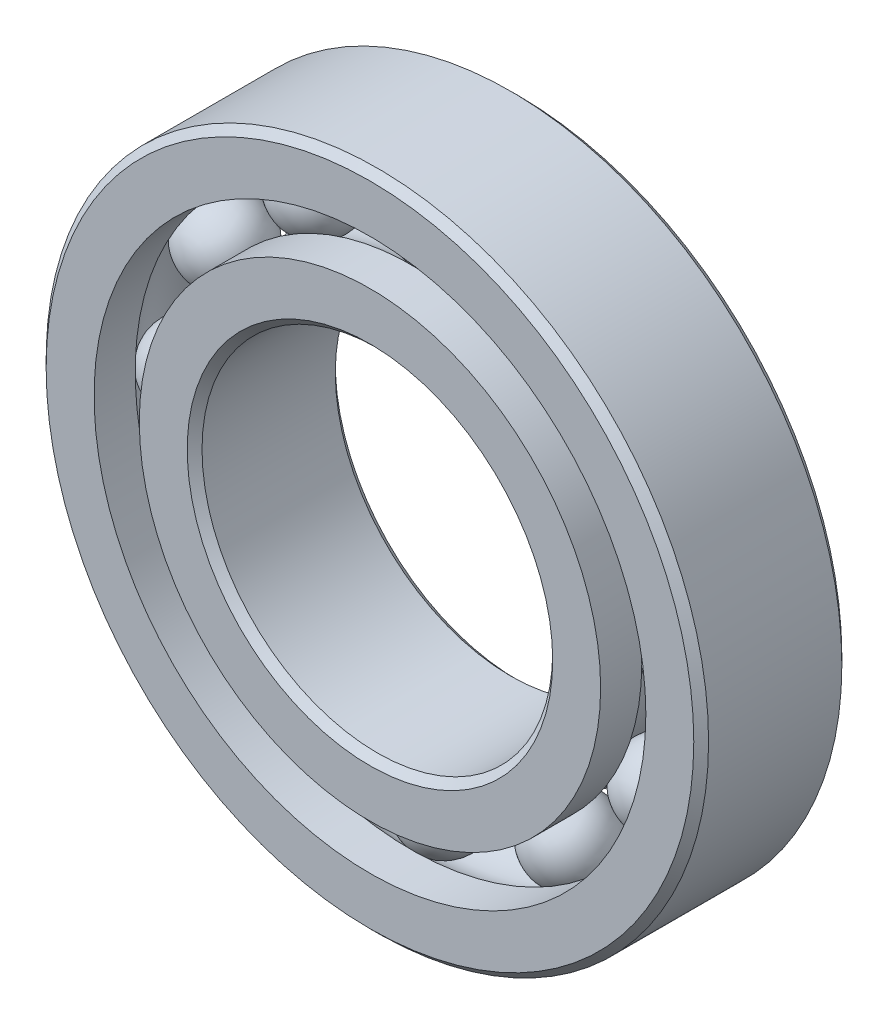
ISO-10303-21;
HEADER;
FILE_DESCRIPTION(('STEP AP214'),'2;1');
FILE_NAME('part.step','',(''),(''),'','','');
FILE_SCHEMA(('AUTOMOTIVE_DESIGN { 1 0 10303 214 1 1 1 1 }'));
ENDSEC;
DATA;
#1=APPLICATION_CONTEXT('core data for automotive mechanical design processes');
#2=APPLICATION_PROTOCOL_DEFINITION('international standard','automotive_design',2000,#1);
#3=PRODUCT_CONTEXT('',#1,'mechanical');
#4=PRODUCT('Part','Part','',(#3));
#5=PRODUCT_RELATED_PRODUCT_CATEGORY('part','',(#4));
#6=PRODUCT_DEFINITION_FORMATION('','',#4);
#7=PRODUCT_DEFINITION_CONTEXT('part definition',#1,'design');
#8=PRODUCT_DEFINITION('design','',#6,#7);
#9=PRODUCT_DEFINITION_SHAPE('','',#8);
#10=(LENGTH_UNIT() NAMED_UNIT(*) SI_UNIT(.MILLI.,.METRE.));
#11=(NAMED_UNIT(*) PLANE_ANGLE_UNIT() SI_UNIT($,.RADIAN.));
#12=(NAMED_UNIT(*) SI_UNIT($,.STERADIAN.) SOLID_ANGLE_UNIT());
#13=UNCERTAINTY_MEASURE_WITH_UNIT(LENGTH_MEASURE(1.E-05),#10,'distance_accuracy_value','');
#14=(GEOMETRIC_REPRESENTATION_CONTEXT(3) GLOBAL_UNCERTAINTY_ASSIGNED_CONTEXT((#13)) GLOBAL_UNIT_ASSIGNED_CONTEXT((#10,
#11,#12)) REPRESENTATION_CONTEXT('',''));
#15=CARTESIAN_POINT('',(0.,0.,0.));
#16=DIRECTION('',(0.,0.,1.));
#17=DIRECTION('',(1.,0.,0.));
#18=AXIS2_PLACEMENT_3D('',#15,#16,#17);
#19=CARTESIAN_POINT('',(-16.2498749999996,28.1456091166435,0.));
#20=DIRECTION('',(0.,0.,1.));
#21=DIRECTION('',(-0.499999999999989,0.866025403784445,0.));
#22=AXIS2_PLACEMENT_3D('',#19,#20,#21);
#23=SPHERICAL_SURFACE('',#22,5.12284445672367);
#24=CARTESIAN_POINT('',(-16.2498749999996,28.1456091166435,5.12284445672366));
#25=VERTEX_POINT('',#24);
#26=VERTEX_LOOP('',#25);
#27=FACE_BOUND('',#26,.T.);
#28=ADVANCED_FACE('F48',(#27),#23,.T.);
#29=CLOSED_SHELL('',(#28));
#30=MANIFOLD_SOLID_BREP('B2',#29);
#31=CARTESIAN_POINT('',(-28.1456091166431,16.2498750000003,0.));
#32=DIRECTION('',(0.,0.,1.));
#33=DIRECTION('',(-0.866025403784433,0.50000000000001,0.));
#34=AXIS2_PLACEMENT_3D('',#31,#32,#33);
#35=SPHERICAL_SURFACE('',#34,5.12284445672367);
#36=CARTESIAN_POINT('',(-28.1456091166431,16.2498750000003,5.12284445672366));
#37=VERTEX_POINT('',#36);
#38=VERTEX_LOOP('',#37);
#39=FACE_BOUND('',#38,.T.);
#40=ADVANCED_FACE('F71',(#39),#35,.T.);
#41=CLOSED_SHELL('',(#40));
#42=MANIFOLD_SOLID_BREP('B7',#41);
#43=CARTESIAN_POINT('',(-32.49975,3.40416811926201E-13,0.));
#44=DIRECTION('',(0.,0.,1.));
#45=DIRECTION('',(-1.,0.,0.));
#46=AXIS2_PLACEMENT_3D('',#43,#44,#45);
#47=SPHERICAL_SURFACE('',#46,5.12284445672367);
#48=CARTESIAN_POINT('',(-32.49975,3.40416811926201E-13,5.12284445672366));
#49=VERTEX_POINT('',#48);
#50=VERTEX_LOOP('',#49);
#51=FACE_BOUND('',#50,.T.);
#52=ADVANCED_FACE('F91',(#51),#47,.T.);
#53=CLOSED_SHELL('',(#52));
#54=MANIFOLD_SOLID_BREP('B44',#53);
#55=CARTESIAN_POINT('',(-28.1456091166435,-16.2498749999997,0.));
#56=DIRECTION('',(0.,0.,1.));
#57=DIRECTION('',(-0.866025403784443,-0.499999999999992,0.));
#58=AXIS2_PLACEMENT_3D('',#55,#56,#57);
#59=SPHERICAL_SURFACE('',#58,5.12284445672367);
#60=CARTESIAN_POINT('',(-28.1456091166435,-16.2498749999997,5.12284445672366));
#61=VERTEX_POINT('',#60);
#62=VERTEX_LOOP('',#61);
#63=FACE_BOUND('',#62,.T.);
#64=ADVANCED_FACE('F111',(#63),#59,.T.);
#65=CLOSED_SHELL('',(#64));
#66=MANIFOLD_SOLID_BREP('B67',#65);
#67=CARTESIAN_POINT('',(-16.2498750000002,-28.1456091166432,0.));
#68=DIRECTION('',(0.,0.,1.));
#69=DIRECTION('',(-0.500000000000007,-0.866025403784435,0.));
#70=AXIS2_PLACEMENT_3D('',#67,#68,#69);
#71=SPHERICAL_SURFACE('',#70,5.12284445672367);
#72=CARTESIAN_POINT('',(-16.2498750000002,-28.1456091166432,5.12284445672366));
#73=VERTEX_POINT('',#72);
#74=VERTEX_LOOP('',#73);
#75=FACE_BOUND('',#74,.T.);
#76=ADVANCED_FACE('F131',(#75),#71,.T.);
#77=CLOSED_SHELL('',(#76));
#78=MANIFOLD_SOLID_BREP('B87',#77);
#79=CARTESIAN_POINT('',(-2.26944541284134E-13,-32.49975,0.));
#80=DIRECTION('',(0.,0.,1.));
#81=DIRECTION('',(0.,-1.,0.));
#82=AXIS2_PLACEMENT_3D('',#79,#80,#81);
#83=SPHERICAL_SURFACE('',#82,5.12284445672367);
#84=CARTESIAN_POINT('',(-2.26944541284134E-13,-32.49975,5.12284445672366));
#85=VERTEX_POINT('',#84);
#86=VERTEX_LOOP('',#85);
#87=FACE_BOUND('',#86,.T.);
#88=ADVANCED_FACE('F151',(#87),#83,.T.);
#89=CLOSED_SHELL('',(#88));
#90=MANIFOLD_SOLID_BREP('B107',#89);
#91=CARTESIAN_POINT('',(16.2498749999998,-28.1456091166434,0.));
#92=DIRECTION('',(0.,0.,1.));
#93=DIRECTION('',(0.499999999999995,-0.866025403784442,0.));
#94=AXIS2_PLACEMENT_3D('',#91,#92,#93);
#95=SPHERICAL_SURFACE('',#94,5.12284445672367);
#96=CARTESIAN_POINT('',(16.2498749999998,-28.1456091166434,5.12284445672366));
#97=VERTEX_POINT('',#96);
#98=VERTEX_LOOP('',#97);
#99=FACE_BOUND('',#98,.T.);
#100=ADVANCED_FACE('F171',(#99),#95,.T.);
#101=CLOSED_SHELL('',(#100));
#102=MANIFOLD_SOLID_BREP('B127',#101);
#103=CARTESIAN_POINT('',(28.1456091166432,-16.2498750000001,0.));
#104=DIRECTION('',(0.,0.,1.));
#105=DIRECTION('',(0.866025403784436,-0.500000000000004,0.));
#106=AXIS2_PLACEMENT_3D('',#103,#104,#105);
#107=SPHERICAL_SURFACE('',#106,5.12284445672367);
#108=CARTESIAN_POINT('',(28.1456091166432,-16.2498750000001,5.12284445672366));
#109=VERTEX_POINT('',#108);
#110=VERTEX_LOOP('',#109);
#111=FACE_BOUND('',#110,.T.);
#112=ADVANCED_FACE('F191',(#111),#107,.T.);
#113=CLOSED_SHELL('',(#112));
#114=MANIFOLD_SOLID_BREP('B147',#113);
#115=CARTESIAN_POINT('',(32.49975,-1.13472270642067E-13,0.));
#116=DIRECTION('',(0.,0.,1.));
#117=DIRECTION('',(1.,0.,0.));
#118=AXIS2_PLACEMENT_3D('',#115,#116,#117);
#119=SPHERICAL_SURFACE('',#118,5.12284445672367);
#120=CARTESIAN_POINT('',(32.49975,-1.13472270642067E-13,5.12284445672366));
#121=VERTEX_POINT('',#120);
#122=VERTEX_LOOP('',#121);
#123=FACE_BOUND('',#122,.T.);
#124=ADVANCED_FACE('F211',(#123),#119,.T.);
#125=CLOSED_SHELL('',(#124));
#126=MANIFOLD_SOLID_BREP('B167',#125);
#127=CARTESIAN_POINT('',(28.1456091166433,16.2498749999999,0.));
#128=DIRECTION('',(0.,0.,1.));
#129=DIRECTION('',(0.86602540378444,0.499999999999998,0.));
#130=AXIS2_PLACEMENT_3D('',#127,#128,#129);
#131=SPHERICAL_SURFACE('',#130,5.12284445672367);
#132=CARTESIAN_POINT('',(28.1456091166433,16.2498749999999,5.12284445672366));
#133=VERTEX_POINT('',#132);
#134=VERTEX_LOOP('',#133);
#135=FACE_BOUND('',#134,.T.);
#136=ADVANCED_FACE('F231',(#135),#131,.T.);
#137=CLOSED_SHELL('',(#136));
#138=MANIFOLD_SOLID_BREP('B187',#137);
#139=CARTESIAN_POINT('',(16.249875,28.1456091166433,0.));
#140=DIRECTION('',(0.,0.,1.));
#141=DIRECTION('',(0.500000000000001,0.866025403784438,0.));
#142=AXIS2_PLACEMENT_3D('',#139,#140,#141);
#143=SPHERICAL_SURFACE('',#142,5.12284445672367);
#144=CARTESIAN_POINT('',(16.249875,28.1456091166433,5.12284445672366));
#145=VERTEX_POINT('',#144);
#146=VERTEX_LOOP('',#145);
#147=FACE_BOUND('',#146,.T.);
#148=ADVANCED_FACE('F252',(#147),#143,.T.);
#149=CLOSED_SHELL('',(#148));
#150=MANIFOLD_SOLID_BREP('B207',#149);
#151=CARTESIAN_POINT('',(0.,32.49975,0.));
#152=DIRECTION('',(0.,0.,1.));
#153=DIRECTION('',(0.,1.,0.));
#154=AXIS2_PLACEMENT_3D('',#151,#152,#153);
#155=SPHERICAL_SURFACE('',#154,5.12284445672367);
#156=CARTESIAN_POINT('',(0.,32.49975,5.12284445672366));
#157=VERTEX_POINT('',#156);
#158=VERTEX_LOOP('',#157);
#159=FACE_BOUND('',#158,.T.);
#160=ADVANCED_FACE('F278',(#159),#155,.T.);
#161=CLOSED_SHELL('',(#160));
#162=MANIFOLD_SOLID_BREP('B227',#161);
#163=CARTESIAN_POINT('',(0.,29.5986510989011,9.5));
#164=DIRECTION('',(0.,0.,-1.));
#165=DIRECTION('',(-1.,0.,0.));
#166=AXIS2_PLACEMENT_3D('',#163,#164,#165);
#167=PLANE('',#166);
#168=CARTESIAN_POINT('',(0.,0.,9.5));
#169=DIRECTION('',(0.,0.,1.));
#170=DIRECTION('',(1.,0.,0.));
#171=AXIS2_PLACEMENT_3D('',#168,#169,#170);
#172=CIRCLE('',#171,23.4495);
#173=CARTESIAN_POINT('',(23.4495,0.,9.5));
#174=VERTEX_POINT('',#173);
#175=EDGE_CURVE('E329',#174,#174,#172,.T.);
#176=ORIENTED_EDGE('',*,*,#175,.F.);
#177=EDGE_LOOP('',(#176));
#178=FACE_BOUND('',#177,.T.);
#179=CARTESIAN_POINT('',(0.,0.,9.5));
#180=DIRECTION('',(0.,0.,1.));
#181=DIRECTION('',(1.,0.,0.));
#182=AXIS2_PLACEMENT_3D('',#179,#180,#181);
#183=CIRCLE('',#182,29.5986510989011);
#184=CARTESIAN_POINT('',(29.5986510989011,0.,9.5));
#185=VERTEX_POINT('',#184);
#186=EDGE_CURVE('E277',#185,#185,#183,.T.);
#187=ORIENTED_EDGE('',*,*,#186,.T.);
#188=EDGE_LOOP('',(#187));
#189=FACE_BOUND('',#188,.T.);
#190=ADVANCED_FACE('F301',(#178,#189),#167,.F.);
#191=CARTESIAN_POINT('',(0.,0.,9.5));
#192=DIRECTION('',(0.,0.,1.));
#193=DIRECTION('',(1.,0.,0.));
#194=AXIS2_PLACEMENT_3D('',#191,#192,#193);
#195=CYLINDRICAL_SURFACE('',#194,29.5986510989011);
#196=ORIENTED_EDGE('',*,*,#186,.F.);
#197=EDGE_LOOP('',(#196));
#198=FACE_BOUND('',#197,.T.);
#199=CARTESIAN_POINT('',(0.,0.,4.22222222222222));
#200=DIRECTION('',(0.,0.,1.));
#201=DIRECTION('',(1.,0.,0.));
#202=AXIS2_PLACEMENT_3D('',#199,#200,#201);
#203=CIRCLE('',#202,29.5986510989011);
#204=CARTESIAN_POINT('',(29.5986510989011,0.,4.22222222222222));
#205=VERTEX_POINT('',#204);
#206=EDGE_CURVE('E307',#205,#205,#203,.T.);
#207=ORIENTED_EDGE('',*,*,#206,.T.);
#208=EDGE_LOOP('',(#207));
#209=FACE_BOUND('',#208,.T.);
#210=ADVANCED_FACE('F336',(#198,#209),#195,.T.);
#211=CARTESIAN_POINT('',(0.,0.,0.));
#212=DIRECTION('',(0.,0.,1.));
#213=DIRECTION('',(1.,0.,0.));
#214=AXIS2_PLACEMENT_3D('',#211,#212,#213);
#215=TOROIDAL_SURFACE('',#214,32.49975,5.12284445672366);
#216=ORIENTED_EDGE('',*,*,#206,.F.);
#217=EDGE_LOOP('',(#216));
#218=FACE_BOUND('',#217,.T.);
#219=CARTESIAN_POINT('',(0.,0.,-4.22222222222223));
#220=DIRECTION('',(0.,0.,1.));
#221=DIRECTION('',(1.,0.,0.));
#222=AXIS2_PLACEMENT_3D('',#219,#220,#221);
#223=CIRCLE('',#222,29.5986510989011);
#224=CARTESIAN_POINT('',(29.5986510989011,0.,-4.22222222222223));
#225=VERTEX_POINT('',#224);
#226=EDGE_CURVE('E311',#225,#225,#223,.T.);
#227=ORIENTED_EDGE('',*,*,#226,.T.);
#228=EDGE_LOOP('',(#227));
#229=FACE_BOUND('',#228,.T.);
#230=ADVANCED_FACE('F340',(#218,#229),#215,.F.);
#231=CARTESIAN_POINT('',(0.,0.,9.5));
#232=DIRECTION('',(0.,0.,1.));
#233=DIRECTION('',(1.,0.,0.));
#234=AXIS2_PLACEMENT_3D('',#231,#232,#233);
#235=CYLINDRICAL_SURFACE('',#234,29.5986510989011);
#236=ORIENTED_EDGE('',*,*,#226,.F.);
#237=EDGE_LOOP('',(#236));
#238=FACE_BOUND('',#237,.T.);
#239=CARTESIAN_POINT('',(0.,0.,-9.5));
#240=DIRECTION('',(0.,0.,1.));
#241=DIRECTION('',(1.,0.,0.));
#242=AXIS2_PLACEMENT_3D('',#239,#240,#241);
#243=CIRCLE('',#242,29.5986510989011);
#244=CARTESIAN_POINT('',(29.5986510989011,0.,-9.5));
#245=VERTEX_POINT('',#244);
#246=EDGE_CURVE('E315',#245,#245,#243,.T.);
#247=ORIENTED_EDGE('',*,*,#246,.T.);
#248=EDGE_LOOP('',(#247));
#249=FACE_BOUND('',#248,.T.);
#250=ADVANCED_FACE('F345',(#238,#249),#235,.T.);
#251=CARTESIAN_POINT('',(0.,23.4495,-9.5));
#252=DIRECTION('',(0.,0.,1.));
#253=DIRECTION('',(1.,0.,0.));
#254=AXIS2_PLACEMENT_3D('',#251,#252,#253);
#255=PLANE('',#254);
#256=ORIENTED_EDGE('',*,*,#246,.F.);
#257=EDGE_LOOP('',(#256));
#258=FACE_BOUND('',#257,.T.);
#259=CARTESIAN_POINT('',(0.,0.,-9.5));
#260=DIRECTION('',(0.,0.,1.));
#261=DIRECTION('',(1.,0.,0.));
#262=AXIS2_PLACEMENT_3D('',#259,#260,#261);
#263=CIRCLE('',#262,23.4495);
#264=CARTESIAN_POINT('',(23.4495,0.,-9.5));
#265=VERTEX_POINT('',#264);
#266=EDGE_CURVE('E320',#265,#265,#263,.T.);
#267=ORIENTED_EDGE('',*,*,#266,.T.);
#268=EDGE_LOOP('',(#267));
#269=FACE_BOUND('',#268,.T.);
#270=ADVANCED_FACE('F351',(#258,#269),#255,.F.);
#271=CARTESIAN_POINT('',(0.,0.,-8.55));
#272=DIRECTION('',(0.,0.,-1.));
#273=DIRECTION('',(-1.,0.,0.));
#274=AXIS2_PLACEMENT_3D('',#271,#272,#273);
#275=CONICAL_SURFACE('',#274,22.4995,0.785398163397448);
#276=ORIENTED_EDGE('',*,*,#266,.F.);
#277=EDGE_LOOP('',(#276));
#278=FACE_BOUND('',#277,.T.);
#279=CARTESIAN_POINT('',(0.,0.,-8.55));
#280=DIRECTION('',(0.,0.,1.));
#281=DIRECTION('',(1.,0.,0.));
#282=AXIS2_PLACEMENT_3D('',#279,#280,#281);
#283=CIRCLE('',#282,22.4995);
#284=CARTESIAN_POINT('',(22.4995,0.,-8.55));
#285=VERTEX_POINT('',#284);
#286=EDGE_CURVE('E323',#285,#285,#283,.T.);
#287=ORIENTED_EDGE('',*,*,#286,.T.);
#288=EDGE_LOOP('',(#287));
#289=FACE_BOUND('',#288,.T.);
#290=ADVANCED_FACE('F355',(#278,#289),#275,.F.);
#291=CARTESIAN_POINT('',(0.,0.,9.5));
#292=DIRECTION('',(0.,0.,1.));
#293=DIRECTION('',(1.,0.,0.));
#294=AXIS2_PLACEMENT_3D('',#291,#292,#293);
#295=CYLINDRICAL_SURFACE('',#294,22.4995);
#296=ORIENTED_EDGE('',*,*,#286,.F.);
#297=EDGE_LOOP('',(#296));
#298=FACE_BOUND('',#297,.T.);
#299=CARTESIAN_POINT('',(0.,0.,8.55));
#300=DIRECTION('',(0.,0.,1.));
#301=DIRECTION('',(1.,0.,0.));
#302=AXIS2_PLACEMENT_3D('',#299,#300,#301);
#303=CIRCLE('',#302,22.4995);
#304=CARTESIAN_POINT('',(22.4995,0.,8.55));
#305=VERTEX_POINT('',#304);
#306=EDGE_CURVE('E326',#305,#305,#303,.T.);
#307=ORIENTED_EDGE('',*,*,#306,.T.);
#308=EDGE_LOOP('',(#307));
#309=FACE_BOUND('',#308,.T.);
#310=ADVANCED_FACE('F359',(#298,#309),#295,.F.);
#311=CARTESIAN_POINT('',(0.,0.,9.5));
#312=DIRECTION('',(0.,0.,1.));
#313=DIRECTION('',(1.,0.,0.));
#314=AXIS2_PLACEMENT_3D('',#311,#312,#313);
#315=CONICAL_SURFACE('',#314,23.4495,0.785398163397451);
#316=ORIENTED_EDGE('',*,*,#306,.F.);
#317=EDGE_LOOP('',(#316));
#318=FACE_BOUND('',#317,.T.);
#319=ORIENTED_EDGE('',*,*,#175,.T.);
#320=EDGE_LOOP('',(#319));
#321=FACE_BOUND('',#320,.T.);
#322=ADVANCED_FACE('F333',(#318,#321),#315,.F.);
#323=CLOSED_SHELL('',(#190,#210,#230,#250,#270,#290,#310,#322));
#324=MANIFOLD_SOLID_BREP('B248',#323);
#325=CARTESIAN_POINT('',(0.,0.,8.55000000000001));
#326=DIRECTION('',(0.,0.,-1.));
#327=DIRECTION('',(-1.,0.,0.));
#328=AXIS2_PLACEMENT_3D('',#325,#326,#327);
#329=CONICAL_SURFACE('',#328,42.5,0.785398163397448);
#330=CARTESIAN_POINT('',(0.,0.,9.50000000000001));
#331=DIRECTION('',(0.,0.,1.));
#332=DIRECTION('',(1.,0.,0.));
#333=AXIS2_PLACEMENT_3D('',#330,#331,#332);
#334=CIRCLE('',#333,41.55);
#335=CARTESIAN_POINT('',(41.55,0.,9.50000000000001));
#336=VERTEX_POINT('',#335);
#337=EDGE_CURVE('E453',#336,#336,#334,.T.);
#338=ORIENTED_EDGE('',*,*,#337,.F.);
#339=EDGE_LOOP('',(#338));
#340=FACE_BOUND('',#339,.T.);
#341=CARTESIAN_POINT('',(0.,0.,8.55000000000001));
#342=DIRECTION('',(0.,0.,1.));
#343=DIRECTION('',(1.,0.,0.));
#344=AXIS2_PLACEMENT_3D('',#341,#342,#343);
#345=CIRCLE('',#344,42.5);
#346=CARTESIAN_POINT('',(42.5,0.,8.55000000000001));
#347=VERTEX_POINT('',#346);
#348=EDGE_CURVE('E300',#347,#347,#345,.T.);
#349=ORIENTED_EDGE('',*,*,#348,.T.);
#350=EDGE_LOOP('',(#349));
#351=FACE_BOUND('',#350,.T.);
#352=ADVANCED_FACE('F425',(#340,#351),#329,.T.);
#353=CARTESIAN_POINT('',(0.,0.,9.5));
#354=DIRECTION('',(0.,0.,1.));
#355=DIRECTION('',(1.,0.,0.));
#356=AXIS2_PLACEMENT_3D('',#353,#354,#355);
#357=CYLINDRICAL_SURFACE('',#356,42.5);
#358=ORIENTED_EDGE('',*,*,#348,.F.);
#359=EDGE_LOOP('',(#358));
#360=FACE_BOUND('',#359,.T.);
#361=CARTESIAN_POINT('',(0.,0.,-8.55));
#362=DIRECTION('',(0.,0.,1.));
#363=DIRECTION('',(1.,0.,0.));
#364=AXIS2_PLACEMENT_3D('',#361,#362,#363);
#365=CIRCLE('',#364,42.5);
#366=CARTESIAN_POINT('',(42.5,0.,-8.55));
#367=VERTEX_POINT('',#366);
#368=EDGE_CURVE('E431',#367,#367,#365,.T.);
#369=ORIENTED_EDGE('',*,*,#368,.T.);
#370=EDGE_LOOP('',(#369));
#371=FACE_BOUND('',#370,.T.);
#372=ADVANCED_FACE('F460',(#360,#371),#357,.T.);
#373=CARTESIAN_POINT('',(0.,0.,-9.5));
#374=DIRECTION('',(0.,0.,1.));
#375=DIRECTION('',(1.,0.,0.));
#376=AXIS2_PLACEMENT_3D('',#373,#374,#375);
#377=CONICAL_SURFACE('',#376,41.55,0.785398163397448);
#378=ORIENTED_EDGE('',*,*,#368,.F.);
#379=EDGE_LOOP('',(#378));
#380=FACE_BOUND('',#379,.T.);
#381=CARTESIAN_POINT('',(0.,0.,-9.5));
#382=DIRECTION('',(0.,0.,1.));
#383=DIRECTION('',(1.,0.,0.));
#384=AXIS2_PLACEMENT_3D('',#381,#382,#383);
#385=CIRCLE('',#384,41.55);
#386=CARTESIAN_POINT('',(41.55,0.,-9.5));
#387=VERTEX_POINT('',#386);
#388=EDGE_CURVE('E435',#387,#387,#385,.T.);
#389=ORIENTED_EDGE('',*,*,#388,.T.);
#390=EDGE_LOOP('',(#389));
#391=FACE_BOUND('',#390,.T.);
#392=ADVANCED_FACE('F464',(#380,#391),#377,.T.);
#393=CARTESIAN_POINT('',(0.,41.55,-9.50000000000001));
#394=DIRECTION('',(0.,0.,1.));
#395=DIRECTION('',(1.,0.,0.));
#396=AXIS2_PLACEMENT_3D('',#393,#394,#395);
#397=PLANE('',#396);
#398=ORIENTED_EDGE('',*,*,#388,.F.);
#399=EDGE_LOOP('',(#398));
#400=FACE_BOUND('',#399,.T.);
#401=CARTESIAN_POINT('',(0.,0.,-9.50000000000001));
#402=DIRECTION('',(0.,0.,1.));
#403=DIRECTION('',(1.,0.,0.));
#404=AXIS2_PLACEMENT_3D('',#401,#402,#403);
#405=CIRCLE('',#404,35.4008489010989);
#406=CARTESIAN_POINT('',(35.4008489010989,0.,-9.50000000000001));
#407=VERTEX_POINT('',#406);
#408=EDGE_CURVE('E439',#407,#407,#405,.T.);
#409=ORIENTED_EDGE('',*,*,#408,.T.);
#410=EDGE_LOOP('',(#409));
#411=FACE_BOUND('',#410,.T.);
#412=ADVANCED_FACE('F469',(#400,#411),#397,.F.);
#413=CARTESIAN_POINT('',(0.,0.,9.5));
#414=DIRECTION('',(0.,0.,1.));
#415=DIRECTION('',(1.,0.,0.));
#416=AXIS2_PLACEMENT_3D('',#413,#414,#415);
#417=CYLINDRICAL_SURFACE('',#416,35.4008489010989);
#418=ORIENTED_EDGE('',*,*,#408,.F.);
#419=EDGE_LOOP('',(#418));
#420=FACE_BOUND('',#419,.T.);
#421=CARTESIAN_POINT('',(0.,0.,-4.22222222222222));
#422=DIRECTION('',(0.,0.,1.));
#423=DIRECTION('',(1.,0.,0.));
#424=AXIS2_PLACEMENT_3D('',#421,#422,#423);
#425=CIRCLE('',#424,35.4008489010989);
#426=CARTESIAN_POINT('',(35.4008489010989,0.,-4.22222222222222));
#427=VERTEX_POINT('',#426);
#428=EDGE_CURVE('E444',#427,#427,#425,.T.);
#429=ORIENTED_EDGE('',*,*,#428,.T.);
#430=EDGE_LOOP('',(#429));
#431=FACE_BOUND('',#430,.T.);
#432=ADVANCED_FACE('F475',(#420,#431),#417,.F.);
#433=CARTESIAN_POINT('',(0.,0.,0.));
#434=DIRECTION('',(0.,0.,1.));
#435=DIRECTION('',(1.,0.,0.));
#436=AXIS2_PLACEMENT_3D('',#433,#434,#435);
#437=TOROIDAL_SURFACE('',#436,32.49975,5.12284445672366);
#438=ORIENTED_EDGE('',*,*,#428,.F.);
#439=EDGE_LOOP('',(#438));
#440=FACE_BOUND('',#439,.T.);
#441=CARTESIAN_POINT('',(0.,0.,4.22222222222222));
#442=DIRECTION('',(0.,0.,1.));
#443=DIRECTION('',(1.,0.,0.));
#444=AXIS2_PLACEMENT_3D('',#441,#442,#443);
#445=CIRCLE('',#444,35.4008489010989);
#446=CARTESIAN_POINT('',(35.4008489010989,0.,4.22222222222222));
#447=VERTEX_POINT('',#446);
#448=EDGE_CURVE('E447',#447,#447,#445,.T.);
#449=ORIENTED_EDGE('',*,*,#448,.T.);
#450=EDGE_LOOP('',(#449));
#451=FACE_BOUND('',#450,.T.);
#452=ADVANCED_FACE('F479',(#440,#451),#437,.F.);
#453=CARTESIAN_POINT('',(0.,0.,9.5));
#454=DIRECTION('',(0.,0.,1.));
#455=DIRECTION('',(1.,0.,0.));
#456=AXIS2_PLACEMENT_3D('',#453,#454,#455);
#457=CYLINDRICAL_SURFACE('',#456,35.4008489010989);
#458=ORIENTED_EDGE('',*,*,#448,.F.);
#459=EDGE_LOOP('',(#458));
#460=FACE_BOUND('',#459,.T.);
#461=CARTESIAN_POINT('',(0.,0.,9.5));
#462=DIRECTION('',(0.,0.,1.));
#463=DIRECTION('',(1.,0.,0.));
#464=AXIS2_PLACEMENT_3D('',#461,#462,#463);
#465=CIRCLE('',#464,35.4008489010989);
#466=CARTESIAN_POINT('',(35.4008489010989,0.,9.5));
#467=VERTEX_POINT('',#466);
#468=EDGE_CURVE('E450',#467,#467,#465,.T.);
#469=ORIENTED_EDGE('',*,*,#468,.T.);
#470=EDGE_LOOP('',(#469));
#471=FACE_BOUND('',#470,.T.);
#472=ADVANCED_FACE('F483',(#460,#471),#457,.F.);
#473=CARTESIAN_POINT('',(0.,41.55,9.50000000000001));
#474=DIRECTION('',(0.,0.,-1.));
#475=DIRECTION('',(-1.,0.,0.));
#476=AXIS2_PLACEMENT_3D('',#473,#474,#475);
#477=PLANE('',#476);
#478=ORIENTED_EDGE('',*,*,#468,.F.);
#479=EDGE_LOOP('',(#478));
#480=FACE_BOUND('',#479,.T.);
#481=ORIENTED_EDGE('',*,*,#337,.T.);
#482=EDGE_LOOP('',(#481));
#483=FACE_BOUND('',#482,.T.);
#484=ADVANCED_FACE('F457',(#480,#483),#477,.F.);
#485=CLOSED_SHELL('',(#352,#372,#392,#412,#432,#452,#472,#484));
#486=MANIFOLD_SOLID_BREP('B272',#485);
#487=ADVANCED_BREP_SHAPE_REPRESENTATION('',(#18,#30,#42,#54,#66,#78,#90,#102,#114,#126,#138,
#150,#162,#324,#486),#14);
#488=SHAPE_DEFINITION_REPRESENTATION(#9,#487);
ENDSEC;
END-ISO-10303-21;
